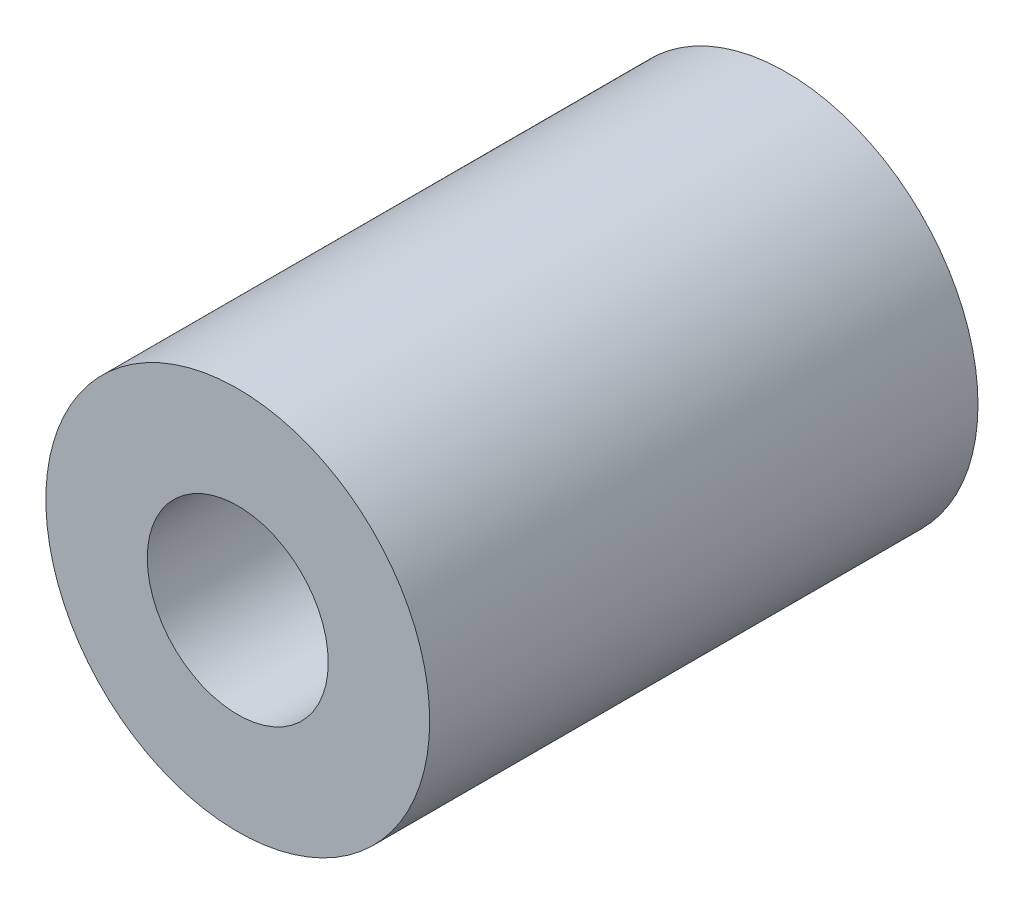
ISO-10303-21;
HEADER;
FILE_DESCRIPTION(('STEP AP214'),'2;1');
FILE_NAME('part.step','',(''),(''),'','','');
FILE_SCHEMA(('AUTOMOTIVE_DESIGN { 1 0 10303 214 1 1 1 1 }'));
ENDSEC;
DATA;
#1=APPLICATION_CONTEXT('core data for automotive mechanical design processes');
#2=APPLICATION_PROTOCOL_DEFINITION('international standard','automotive_design',2000,#1);
#3=PRODUCT_CONTEXT('',#1,'mechanical');
#4=PRODUCT('Part','Part','',(#3));
#5=PRODUCT_RELATED_PRODUCT_CATEGORY('part','',(#4));
#6=PRODUCT_DEFINITION_FORMATION('','',#4);
#7=PRODUCT_DEFINITION_CONTEXT('part definition',#1,'design');
#8=PRODUCT_DEFINITION('design','',#6,#7);
#9=PRODUCT_DEFINITION_SHAPE('','',#8);
#10=(LENGTH_UNIT() NAMED_UNIT(*) SI_UNIT(.MILLI.,.METRE.));
#11=(NAMED_UNIT(*) PLANE_ANGLE_UNIT() SI_UNIT($,.RADIAN.));
#12=(NAMED_UNIT(*) SI_UNIT($,.STERADIAN.) SOLID_ANGLE_UNIT());
#13=UNCERTAINTY_MEASURE_WITH_UNIT(LENGTH_MEASURE(1.E-05),#10,'distance_accuracy_value','');
#14=(GEOMETRIC_REPRESENTATION_CONTEXT(3) GLOBAL_UNCERTAINTY_ASSIGNED_CONTEXT((#13)) GLOBAL_UNIT_ASSIGNED_CONTEXT((#10,
#11,#12)) REPRESENTATION_CONTEXT('',''));
#15=CARTESIAN_POINT('',(0.,0.,0.));
#16=DIRECTION('',(0.,0.,1.));
#17=DIRECTION('',(1.,0.,0.));
#18=AXIS2_PLACEMENT_3D('',#15,#16,#17);
#19=CARTESIAN_POINT('',(0.,0.,10.));
#20=DIRECTION('',(0.,0.,1.));
#21=DIRECTION('',(1.,0.,0.));
#22=AXIS2_PLACEMENT_3D('',#19,#20,#21);
#23=PLANE('',#22);
#24=CARTESIAN_POINT('',(0.,0.,10.));
#25=DIRECTION('',(0.,0.,1.));
#26=DIRECTION('',(1.,0.,0.));
#27=AXIS2_PLACEMENT_3D('',#24,#25,#26);
#28=CIRCLE('',#27,3.5);
#29=CARTESIAN_POINT('',(3.5,0.,10.));
#30=VERTEX_POINT('',#29);
#31=EDGE_CURVE('E10',#30,#30,#28,.T.);
#32=ORIENTED_EDGE('',*,*,#31,.T.);
#33=EDGE_LOOP('',(#32));
#34=FACE_BOUND('',#33,.T.);
#35=CARTESIAN_POINT('',(0.,0.,10.));
#36=DIRECTION('',(0.,0.,1.));
#37=DIRECTION('',(1.,0.,0.));
#38=AXIS2_PLACEMENT_3D('',#35,#36,#37);
#39=CIRCLE('',#38,1.65);
#40=CARTESIAN_POINT('',(1.65,0.,10.));
#41=VERTEX_POINT('',#40);
#42=EDGE_CURVE('E52',#41,#41,#39,.T.);
#43=ORIENTED_EDGE('',*,*,#42,.F.);
#44=EDGE_LOOP('',(#43));
#45=FACE_BOUND('',#44,.T.);
#46=ADVANCED_FACE('F41',(#34,#45),#23,.T.);
#47=CARTESIAN_POINT('',(0.,0.,0.));
#48=DIRECTION('',(0.,0.,1.));
#49=DIRECTION('',(1.,0.,0.));
#50=AXIS2_PLACEMENT_3D('',#47,#48,#49);
#51=PLANE('',#50);
#52=CARTESIAN_POINT('',(0.,0.,0.));
#53=DIRECTION('',(0.,0.,1.));
#54=DIRECTION('',(1.,0.,0.));
#55=AXIS2_PLACEMENT_3D('',#52,#53,#54);
#56=CIRCLE('',#55,3.5);
#57=CARTESIAN_POINT('',(3.5,0.,0.));
#58=VERTEX_POINT('',#57);
#59=EDGE_CURVE('E45',#58,#58,#56,.T.);
#60=ORIENTED_EDGE('',*,*,#59,.F.);
#61=EDGE_LOOP('',(#60));
#62=FACE_BOUND('',#61,.T.);
#63=CARTESIAN_POINT('',(0.,0.,0.));
#64=DIRECTION('',(0.,0.,1.));
#65=DIRECTION('',(1.,0.,0.));
#66=AXIS2_PLACEMENT_3D('',#63,#64,#65);
#67=CIRCLE('',#66,1.65);
#68=CARTESIAN_POINT('',(1.65,0.,0.));
#69=VERTEX_POINT('',#68);
#70=EDGE_CURVE('E54',#69,#69,#67,.T.);
#71=ORIENTED_EDGE('',*,*,#70,.T.);
#72=EDGE_LOOP('',(#71));
#73=FACE_BOUND('',#72,.T.);
#74=ADVANCED_FACE('F64',(#62,#73),#51,.F.);
#75=CARTESIAN_POINT('',(0.,0.,10.));
#76=DIRECTION('',(0.,0.,-1.));
#77=DIRECTION('',(-1.,0.,0.));
#78=AXIS2_PLACEMENT_3D('',#75,#76,#77);
#79=CYLINDRICAL_SURFACE('',#78,3.5);
#80=ORIENTED_EDGE('',*,*,#31,.F.);
#81=EDGE_LOOP('',(#80));
#82=FACE_BOUND('',#81,.T.);
#83=ORIENTED_EDGE('',*,*,#59,.T.);
#84=EDGE_LOOP('',(#83));
#85=FACE_BOUND('',#84,.T.);
#86=ADVANCED_FACE('F43',(#82,#85),#79,.T.);
#87=CARTESIAN_POINT('',(0.,0.,10.));
#88=DIRECTION('',(0.,0.,-1.));
#89=DIRECTION('',(-1.,0.,0.));
#90=AXIS2_PLACEMENT_3D('',#87,#88,#89);
#91=CYLINDRICAL_SURFACE('',#90,1.65);
#92=ORIENTED_EDGE('',*,*,#42,.T.);
#93=EDGE_LOOP('',(#92));
#94=FACE_BOUND('',#93,.T.);
#95=ORIENTED_EDGE('',*,*,#70,.F.);
#96=EDGE_LOOP('',(#95));
#97=FACE_BOUND('',#96,.T.);
#98=ADVANCED_FACE('F60',(#94,#97),#91,.F.);
#99=CLOSED_SHELL('',(#46,#74,#86,#98));
#100=MANIFOLD_SOLID_BREP('B2',#99);
#101=ADVANCED_BREP_SHAPE_REPRESENTATION('',(#18,#100),#14);
#102=SHAPE_DEFINITION_REPRESENTATION(#9,#101);
ENDSEC;
END-ISO-10303-21;
